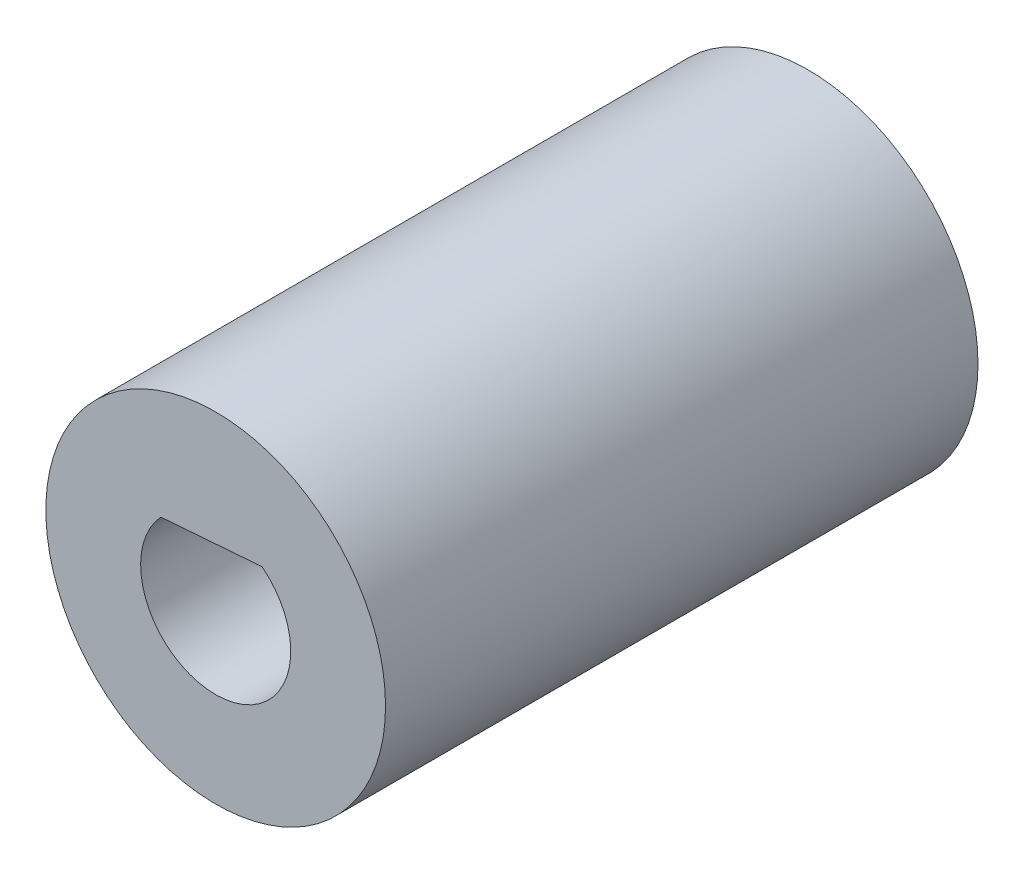
ISO-10303-21;
HEADER;
FILE_DESCRIPTION(('STEP AP214'),'2;1');
FILE_NAME('part.step','',(''),(''),'','','');
FILE_SCHEMA(('AUTOMOTIVE_DESIGN { 1 0 10303 214 1 1 1 1 }'));
ENDSEC;
DATA;
#1=APPLICATION_CONTEXT('core data for automotive mechanical design processes');
#2=APPLICATION_PROTOCOL_DEFINITION('international standard','automotive_design',2000,#1);
#3=PRODUCT_CONTEXT('',#1,'mechanical');
#4=PRODUCT('Part','Part','',(#3));
#5=PRODUCT_RELATED_PRODUCT_CATEGORY('part','',(#4));
#6=PRODUCT_DEFINITION_FORMATION('','',#4);
#7=PRODUCT_DEFINITION_CONTEXT('part definition',#1,'design');
#8=PRODUCT_DEFINITION('design','',#6,#7);
#9=PRODUCT_DEFINITION_SHAPE('','',#8);
#10=(LENGTH_UNIT() NAMED_UNIT(*) SI_UNIT(.MILLI.,.METRE.));
#11=(NAMED_UNIT(*) PLANE_ANGLE_UNIT() SI_UNIT($,.RADIAN.));
#12=(NAMED_UNIT(*) SI_UNIT($,.STERADIAN.) SOLID_ANGLE_UNIT());
#13=UNCERTAINTY_MEASURE_WITH_UNIT(LENGTH_MEASURE(1.E-05),#10,'distance_accuracy_value','');
#14=(GEOMETRIC_REPRESENTATION_CONTEXT(3) GLOBAL_UNCERTAINTY_ASSIGNED_CONTEXT((#13)) GLOBAL_UNIT_ASSIGNED_CONTEXT((#10,
#11,#12)) REPRESENTATION_CONTEXT('',''));
#15=CARTESIAN_POINT('',(0.,0.,0.));
#16=DIRECTION('',(0.,0.,1.));
#17=DIRECTION('',(1.,0.,0.));
#18=AXIS2_PLACEMENT_3D('',#15,#16,#17);
#19=CARTESIAN_POINT('',(0.,0.,15.));
#20=DIRECTION('',(0.,0.,1.));
#21=DIRECTION('',(1.,0.,0.));
#22=AXIS2_PLACEMENT_3D('',#19,#20,#21);
#23=PLANE('',#22);
#24=CARTESIAN_POINT('',(0.,0.,15.));
#25=DIRECTION('',(0.,0.,1.));
#26=DIRECTION('',(1.,0.,0.));
#27=AXIS2_PLACEMENT_3D('',#24,#25,#26);
#28=CIRCLE('',#27,4.3);
#29=CARTESIAN_POINT('',(4.3,0.,15.));
#30=VERTEX_POINT('',#29);
#31=EDGE_CURVE('E11',#30,#30,#28,.T.);
#32=ORIENTED_EDGE('',*,*,#31,.T.);
#33=EDGE_LOOP('',(#32));
#34=FACE_BOUND('',#33,.T.);
#35=DIRECTION('',(-0.9971601765434,-0.0753099084844495,0.));
#36=VECTOR('',#35,1.);
#37=CARTESIAN_POINT('',(-1.3863093104665,1.29928691816469,15.));
#38=LINE('',#37,#36);
#39=CARTESIAN_POINT('',(1.17544156671004,1.49276157615683,15.));
#40=VERTEX_POINT('',#39);
#41=CARTESIAN_POINT('',(-1.3863093104665,1.29928691816469,15.));
#42=VERTEX_POINT('',#41);
#43=EDGE_CURVE('E84',#40,#42,#38,.T.);
#44=ORIENTED_EDGE('',*,*,#43,.F.);
#45=CARTESIAN_POINT('',(0.,0.,15.));
#46=DIRECTION('',(0.,0.,1.));
#47=DIRECTION('',(1.,0.,0.));
#48=AXIS2_PLACEMENT_3D('',#45,#46,#47);
#49=CIRCLE('',#48,1.9);
#50=EDGE_CURVE('E73',#42,#40,#49,.T.);
#51=ORIENTED_EDGE('',*,*,#50,.F.);
#52=EDGE_LOOP('',(#44,#51));
#53=FACE_BOUND('',#52,.T.);
#54=ADVANCED_FACE('F39',(#34,#53),#23,.T.);
#55=CARTESIAN_POINT('',(0.,0.,0.));
#56=DIRECTION('',(0.,0.,1.));
#57=DIRECTION('',(1.,0.,0.));
#58=AXIS2_PLACEMENT_3D('',#55,#56,#57);
#59=PLANE('',#58);
#60=CARTESIAN_POINT('',(0.,0.,0.));
#61=DIRECTION('',(0.,0.,1.));
#62=DIRECTION('',(1.,0.,0.));
#63=AXIS2_PLACEMENT_3D('',#60,#61,#62);
#64=CIRCLE('',#63,4.3);
#65=CARTESIAN_POINT('',(4.3,0.,0.));
#66=VERTEX_POINT('',#65);
#67=EDGE_CURVE('E43',#66,#66,#64,.T.);
#68=ORIENTED_EDGE('',*,*,#67,.F.);
#69=EDGE_LOOP('',(#68));
#70=FACE_BOUND('',#69,.T.);
#71=CARTESIAN_POINT('',(0.,0.,0.));
#72=DIRECTION('',(0.,0.,1.));
#73=DIRECTION('',(1.,0.,0.));
#74=AXIS2_PLACEMENT_3D('',#71,#72,#73);
#75=CIRCLE('',#74,1.9);
#76=CARTESIAN_POINT('',(-1.3863093104665,1.29928691816469,0.));
#77=VERTEX_POINT('',#76);
#78=CARTESIAN_POINT('',(1.17544156671004,1.49276157615683,0.));
#79=VERTEX_POINT('',#78);
#80=EDGE_CURVE('E62',#77,#79,#75,.T.);
#81=ORIENTED_EDGE('',*,*,#80,.T.);
#82=DIRECTION('',(-0.9971601765434,-0.0753099084844495,0.));
#83=VECTOR('',#82,1.);
#84=CARTESIAN_POINT('',(-1.3863093104665,1.29928691816469,0.));
#85=LINE('',#84,#83);
#86=EDGE_CURVE('E68',#79,#77,#85,.T.);
#87=ORIENTED_EDGE('',*,*,#86,.T.);
#88=EDGE_LOOP('',(#81,#87));
#89=FACE_BOUND('',#88,.T.);
#90=ADVANCED_FACE('F80',(#70,#89),#59,.F.);
#91=CARTESIAN_POINT('',(0.,0.,15.));
#92=DIRECTION('',(0.,0.,-1.));
#93=DIRECTION('',(-1.,0.,0.));
#94=AXIS2_PLACEMENT_3D('',#91,#92,#93);
#95=CYLINDRICAL_SURFACE('',#94,4.3);
#96=ORIENTED_EDGE('',*,*,#31,.F.);
#97=EDGE_LOOP('',(#96));
#98=FACE_BOUND('',#97,.T.);
#99=ORIENTED_EDGE('',*,*,#67,.T.);
#100=EDGE_LOOP('',(#99));
#101=FACE_BOUND('',#100,.T.);
#102=ADVANCED_FACE('F41',(#98,#101),#95,.T.);
#103=CARTESIAN_POINT('',(0.,0.,15.));
#104=DIRECTION('',(0.,0.,-1.));
#105=DIRECTION('',(-1.,0.,0.));
#106=AXIS2_PLACEMENT_3D('',#103,#104,#105);
#107=CYLINDRICAL_SURFACE('',#106,1.9);
#108=ORIENTED_EDGE('',*,*,#80,.F.);
#109=DIRECTION('',(0.,0.,-1.));
#110=VECTOR('',#109,1.);
#111=CARTESIAN_POINT('',(-1.3863093104665,1.29928691816469,15.));
#112=LINE('',#111,#110);
#113=EDGE_CURVE('E70',#42,#77,#112,.T.);
#114=ORIENTED_EDGE('',*,*,#113,.F.);
#115=ORIENTED_EDGE('',*,*,#50,.T.);
#116=DIRECTION('',(0.,0.,-1.));
#117=VECTOR('',#116,1.);
#118=CARTESIAN_POINT('',(1.17544156671004,1.49276157615683,15.));
#119=LINE('',#118,#117);
#120=EDGE_CURVE('E55',#40,#79,#119,.T.);
#121=ORIENTED_EDGE('',*,*,#120,.T.);
#122=EDGE_LOOP('',(#108,#114,#115,#121));
#123=FACE_BOUND('',#122,.T.);
#124=ADVANCED_FACE('F75',(#123),#107,.F.);
#125=CARTESIAN_POINT('',(-1.3863093104665,1.29928691816469,15.));
#126=DIRECTION('',(0.0753099084844495,-0.9971601765434,0.));
#127=DIRECTION('',(0.9971601765434,0.0753099084844495,0.));
#128=AXIS2_PLACEMENT_3D('',#125,#126,#127);
#129=PLANE('',#128);
#130=ORIENTED_EDGE('',*,*,#86,.F.);
#131=ORIENTED_EDGE('',*,*,#120,.F.);
#132=ORIENTED_EDGE('',*,*,#43,.T.);
#133=ORIENTED_EDGE('',*,*,#113,.T.);
#134=EDGE_LOOP('',(#130,#131,#132,#133));
#135=FACE_BOUND('',#134,.T.);
#136=ADVANCED_FACE('F69',(#135),#129,.T.);
#137=CLOSED_SHELL('',(#54,#90,#102,#124,#136));
#138=MANIFOLD_SOLID_BREP('B2',#137);
#139=ADVANCED_BREP_SHAPE_REPRESENTATION('',(#18,#138),#14);
#140=SHAPE_DEFINITION_REPRESENTATION(#9,#139);
ENDSEC;
END-ISO-10303-21;
